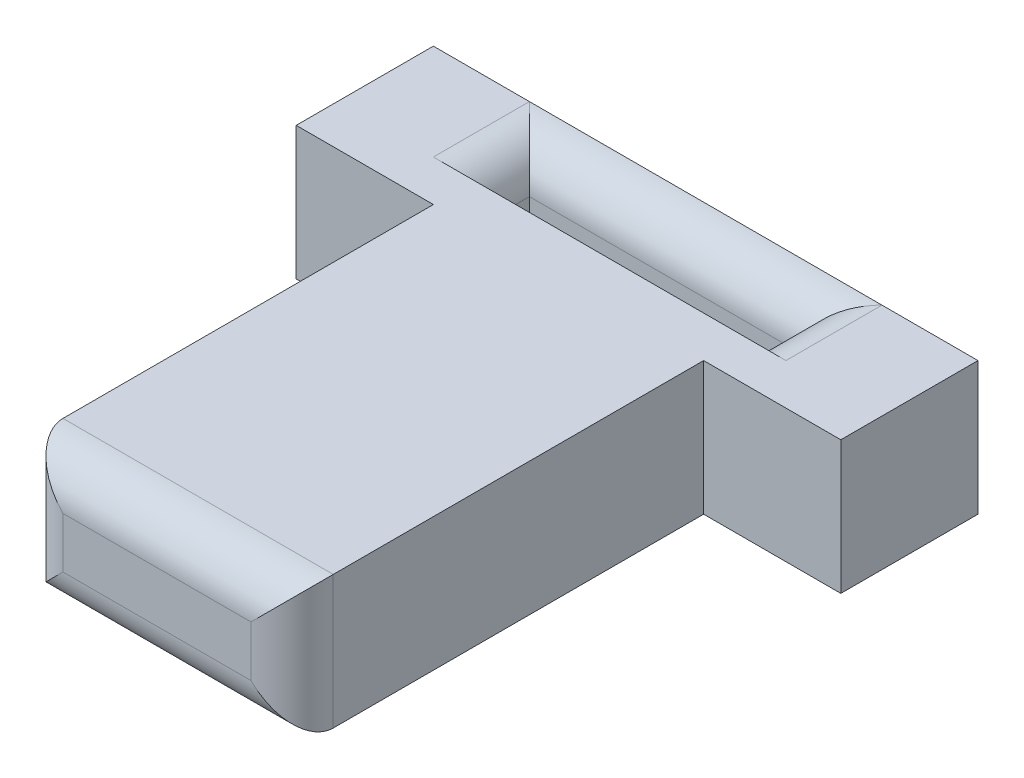
ISO-10303-21;
HEADER;
FILE_DESCRIPTION(('STEP AP214'),'2;1');
FILE_NAME('part.step','',(''),(''),'','','');
FILE_SCHEMA(('AUTOMOTIVE_DESIGN { 1 0 10303 214 1 1 1 1 }'));
ENDSEC;
DATA;
#1=APPLICATION_CONTEXT('core data for automotive mechanical design processes');
#2=APPLICATION_PROTOCOL_DEFINITION('international standard','automotive_design',2000,#1);
#3=PRODUCT_CONTEXT('',#1,'mechanical');
#4=PRODUCT('Part','Part','',(#3));
#5=PRODUCT_RELATED_PRODUCT_CATEGORY('part','',(#4));
#6=PRODUCT_DEFINITION_FORMATION('','',#4);
#7=PRODUCT_DEFINITION_CONTEXT('part definition',#1,'design');
#8=PRODUCT_DEFINITION('design','',#6,#7);
#9=PRODUCT_DEFINITION_SHAPE('','',#8);
#10=(LENGTH_UNIT() NAMED_UNIT(*) SI_UNIT(.MILLI.,.METRE.));
#11=(NAMED_UNIT(*) PLANE_ANGLE_UNIT() SI_UNIT($,.RADIAN.));
#12=(NAMED_UNIT(*) SI_UNIT($,.STERADIAN.) SOLID_ANGLE_UNIT());
#13=UNCERTAINTY_MEASURE_WITH_UNIT(LENGTH_MEASURE(1.E-05),#10,'distance_accuracy_value','');
#14=(GEOMETRIC_REPRESENTATION_CONTEXT(3) GLOBAL_UNCERTAINTY_ASSIGNED_CONTEXT((#13)) GLOBAL_UNIT_ASSIGNED_CONTEXT((#10,
#11,#12)) REPRESENTATION_CONTEXT('',''));
#15=CARTESIAN_POINT('',(0.,0.,0.));
#16=DIRECTION('',(0.,0.,1.));
#17=DIRECTION('',(1.,0.,0.));
#18=AXIS2_PLACEMENT_3D('',#15,#16,#17);
#19=CARTESIAN_POINT('',(-9.85,4.85,30.));
#20=DIRECTION('',(1.,0.,0.));
#21=DIRECTION('',(0.,1.,0.));
#22=AXIS2_PLACEMENT_3D('',#19,#20,#21);
#23=PLANE('',#22);
#24=DIRECTION('',(0.,0.,-1.));
#25=VECTOR('',#24,1.);
#26=CARTESIAN_POINT('',(-9.85,-4.85,30.));
#27=LINE('',#26,#25);
#28=CARTESIAN_POINT('',(-9.85,-4.85,27.));
#29=VERTEX_POINT('',#28);
#30=CARTESIAN_POINT('',(-9.85,-4.85,0.));
#31=VERTEX_POINT('',#30);
#32=EDGE_CURVE('E210',#29,#31,#27,.T.);
#33=ORIENTED_EDGE('',*,*,#32,.F.);
#34=DIRECTION('',(0.,-1.,0.));
#35=VECTOR('',#34,1.);
#36=CARTESIAN_POINT('',(-9.85,4.85,27.));
#37=LINE('',#36,#35);
#38=CARTESIAN_POINT('',(-9.85,4.85,27.));
#39=VERTEX_POINT('',#38);
#40=EDGE_CURVE('E11',#29,#39,#37,.F.);
#41=ORIENTED_EDGE('',*,*,#40,.T.);
#42=DIRECTION('',(0.,0.,-1.));
#43=VECTOR('',#42,1.);
#44=CARTESIAN_POINT('',(-9.85,4.85,30.));
#45=LINE('',#44,#43);
#46=CARTESIAN_POINT('',(-9.85,4.85,0.));
#47=VERTEX_POINT('',#46);
#48=EDGE_CURVE('E204',#39,#47,#45,.T.);
#49=ORIENTED_EDGE('',*,*,#48,.T.);
#50=DIRECTION('',(0.,-1.,0.));
#51=VECTOR('',#50,1.);
#52=CARTESIAN_POINT('',(-9.85,4.85,0.));
#53=LINE('',#52,#51);
#54=EDGE_CURVE('E191',#47,#31,#53,.T.);
#55=ORIENTED_EDGE('',*,*,#54,.T.);
#56=EDGE_LOOP('',(#33,#41,#49,#55));
#57=FACE_BOUND('',#56,.T.);
#58=ADVANCED_FACE('F37',(#57),#23,.F.);
#59=CARTESIAN_POINT('',(9.85,-4.85,30.));
#60=DIRECTION('',(0.,1.,0.));
#61=DIRECTION('',(-1.,0.,0.));
#62=AXIS2_PLACEMENT_3D('',#59,#60,#61);
#63=PLANE('',#62);
#64=DIRECTION('',(0.,0.,-1.));
#65=VECTOR('',#64,1.);
#66=CARTESIAN_POINT('',(9.85,-4.85,30.));
#67=LINE('',#66,#65);
#68=CARTESIAN_POINT('',(9.85,-4.85,27.));
#69=VERTEX_POINT('',#68);
#70=CARTESIAN_POINT('',(9.85,-4.85,0.));
#71=VERTEX_POINT('',#70);
#72=EDGE_CURVE('E208',#69,#71,#67,.T.);
#73=ORIENTED_EDGE('',*,*,#72,.F.);
#74=DIRECTION('',(1.,0.,0.));
#75=VECTOR('',#74,1.);
#76=CARTESIAN_POINT('',(9.85,-4.85,27.));
#77=LINE('',#76,#75);
#78=EDGE_CURVE('E46',#69,#29,#77,.F.);
#79=ORIENTED_EDGE('',*,*,#78,.T.);
#80=ORIENTED_EDGE('',*,*,#32,.T.);
#81=DIRECTION('',(-1.,0.,0.));
#82=VECTOR('',#81,1.);
#83=CARTESIAN_POINT('',(-19.85,-4.85,0.));
#84=LINE('',#83,#82);
#85=CARTESIAN_POINT('',(-19.85,-4.85,0.));
#86=VERTEX_POINT('',#85);
#87=EDGE_CURVE('E590',#31,#86,#84,.T.);
#88=ORIENTED_EDGE('',*,*,#87,.T.);
#89=DIRECTION('',(0.,0.,1.));
#90=VECTOR('',#89,1.);
#91=CARTESIAN_POINT('',(-19.85,-4.85,-10.));
#92=LINE('',#91,#90);
#93=CARTESIAN_POINT('',(-19.85,-4.85,-10.));
#94=VERTEX_POINT('',#93);
#95=EDGE_CURVE('E192',#94,#86,#92,.T.);
#96=ORIENTED_EDGE('',*,*,#95,.F.);
#97=DIRECTION('',(-1.,0.,0.));
#98=VECTOR('',#97,1.);
#99=CARTESIAN_POINT('',(-19.85,-4.85,-10.));
#100=LINE('',#99,#98);
#101=CARTESIAN_POINT('',(-12.85,-4.85,-10.));
#102=VERTEX_POINT('',#101);
#103=EDGE_CURVE('E177',#102,#94,#100,.T.);
#104=ORIENTED_EDGE('',*,*,#103,.F.);
#105=DIRECTION('',(0.,0.,1.));
#106=VECTOR('',#105,1.);
#107=CARTESIAN_POINT('',(-12.85,-4.85,30.));
#108=LINE('',#107,#106);
#109=CARTESIAN_POINT('',(-12.85,-4.85,-3.));
#110=VERTEX_POINT('',#109);
#111=EDGE_CURVE('E213',#102,#110,#108,.T.);
#112=ORIENTED_EDGE('',*,*,#111,.T.);
#113=DIRECTION('',(1.,0.,0.));
#114=VECTOR('',#113,1.);
#115=CARTESIAN_POINT('',(9.84999999999999,-4.85,-3.));
#116=LINE('',#115,#114);
#117=CARTESIAN_POINT('',(12.85,-4.85,-3.));
#118=VERTEX_POINT('',#117);
#119=EDGE_CURVE('E592',#110,#118,#116,.T.);
#120=ORIENTED_EDGE('',*,*,#119,.T.);
#121=DIRECTION('',(0.,0.,-1.));
#122=VECTOR('',#121,1.);
#123=CARTESIAN_POINT('',(12.85,-4.85,30.));
#124=LINE('',#123,#122);
#125=CARTESIAN_POINT('',(12.85,-4.85,-10.));
#126=VERTEX_POINT('',#125);
#127=EDGE_CURVE('E170',#118,#126,#124,.T.);
#128=ORIENTED_EDGE('',*,*,#127,.T.);
#129=CARTESIAN_POINT('',(19.85,-4.85,-10.));
#130=VERTEX_POINT('',#129);
#131=EDGE_CURVE('E162',#130,#126,#100,.T.);
#132=ORIENTED_EDGE('',*,*,#131,.F.);
#133=DIRECTION('',(0.,0.,1.));
#134=VECTOR('',#133,1.);
#135=CARTESIAN_POINT('',(19.85,-4.85,-10.));
#136=LINE('',#135,#134);
#137=CARTESIAN_POINT('',(19.85,-4.85,0.));
#138=VERTEX_POINT('',#137);
#139=EDGE_CURVE('E167',#130,#138,#136,.T.);
#140=ORIENTED_EDGE('',*,*,#139,.T.);
#141=EDGE_CURVE('E578',#138,#71,#84,.T.);
#142=ORIENTED_EDGE('',*,*,#141,.T.);
#143=EDGE_LOOP('',(#73,#79,#80,#88,#96,#104,#112,#120,#128,#132,#140,#142));
#144=FACE_BOUND('',#143,.T.);
#145=ADVANCED_FACE('F164',(#144),#63,.F.);
#146=CARTESIAN_POINT('',(9.85,4.85,30.));
#147=DIRECTION('',(-1.,0.,0.));
#148=DIRECTION('',(0.,-1.,0.));
#149=AXIS2_PLACEMENT_3D('',#146,#147,#148);
#150=PLANE('',#149);
#151=DIRECTION('',(0.,0.,-1.));
#152=VECTOR('',#151,1.);
#153=CARTESIAN_POINT('',(9.85,4.85,30.));
#154=LINE('',#153,#152);
#155=CARTESIAN_POINT('',(9.85,4.85,27.));
#156=VERTEX_POINT('',#155);
#157=CARTESIAN_POINT('',(9.85,4.85,0.));
#158=VERTEX_POINT('',#157);
#159=EDGE_CURVE('E206',#156,#158,#154,.T.);
#160=ORIENTED_EDGE('',*,*,#159,.F.);
#161=DIRECTION('',(0.,1.,0.));
#162=VECTOR('',#161,1.);
#163=CARTESIAN_POINT('',(9.85,4.85,27.));
#164=LINE('',#163,#162);
#165=EDGE_CURVE('E61',#156,#69,#164,.F.);
#166=ORIENTED_EDGE('',*,*,#165,.T.);
#167=ORIENTED_EDGE('',*,*,#72,.T.);
#168=DIRECTION('',(0.,1.,0.));
#169=VECTOR('',#168,1.);
#170=CARTESIAN_POINT('',(9.85,4.85,0.));
#171=LINE('',#170,#169);
#172=EDGE_CURVE('E195',#71,#158,#171,.T.);
#173=ORIENTED_EDGE('',*,*,#172,.T.);
#174=EDGE_LOOP('',(#160,#166,#167,#173));
#175=FACE_BOUND('',#174,.T.);
#176=ADVANCED_FACE('F313',(#175),#150,.F.);
#177=CARTESIAN_POINT('',(9.85,4.85,30.));
#178=DIRECTION('',(0.,-1.,0.));
#179=DIRECTION('',(1.,0.,0.));
#180=AXIS2_PLACEMENT_3D('',#177,#178,#179);
#181=PLANE('',#180);
#182=ORIENTED_EDGE('',*,*,#48,.F.);
#183=DIRECTION('',(-1.,0.,0.));
#184=VECTOR('',#183,1.);
#185=CARTESIAN_POINT('',(9.85,4.85,27.));
#186=LINE('',#185,#184);
#187=EDGE_CURVE('E265',#39,#156,#186,.F.);
#188=ORIENTED_EDGE('',*,*,#187,.T.);
#189=ORIENTED_EDGE('',*,*,#159,.T.);
#190=DIRECTION('',(1.,0.,0.));
#191=VECTOR('',#190,1.);
#192=CARTESIAN_POINT('',(-19.85,4.85,0.));
#193=LINE('',#192,#191);
#194=CARTESIAN_POINT('',(19.85,4.85,0.));
#195=VERTEX_POINT('',#194);
#196=EDGE_CURVE('E575',#158,#195,#193,.T.);
#197=ORIENTED_EDGE('',*,*,#196,.T.);
#198=DIRECTION('',(0.,0.,1.));
#199=VECTOR('',#198,1.);
#200=CARTESIAN_POINT('',(19.85,4.85,-10.));
#201=LINE('',#200,#199);
#202=CARTESIAN_POINT('',(19.85,4.85,-10.));
#203=VERTEX_POINT('',#202);
#204=EDGE_CURVE('E582',#203,#195,#201,.T.);
#205=ORIENTED_EDGE('',*,*,#204,.F.);
#206=DIRECTION('',(1.,0.,0.));
#207=VECTOR('',#206,1.);
#208=CARTESIAN_POINT('',(-19.85,4.85,-10.));
#209=LINE('',#208,#207);
#210=CARTESIAN_POINT('',(12.85,4.85,-10.));
#211=VERTEX_POINT('',#210);
#212=EDGE_CURVE('E182',#211,#203,#209,.T.);
#213=ORIENTED_EDGE('',*,*,#212,.F.);
#214=DIRECTION('',(0.,0.,-1.));
#215=VECTOR('',#214,1.);
#216=CARTESIAN_POINT('',(12.85,4.85,30.));
#217=LINE('',#216,#215);
#218=CARTESIAN_POINT('',(12.85,4.85,-3.));
#219=VERTEX_POINT('',#218);
#220=EDGE_CURVE('E227',#211,#219,#217,.F.);
#221=ORIENTED_EDGE('',*,*,#220,.T.);
#222=DIRECTION('',(1.,0.,0.));
#223=VECTOR('',#222,1.);
#224=CARTESIAN_POINT('',(9.85,4.85,-3.));
#225=LINE('',#224,#223);
#226=CARTESIAN_POINT('',(-12.85,4.85,-3.));
#227=VERTEX_POINT('',#226);
#228=EDGE_CURVE('E252',#227,#219,#225,.T.);
#229=ORIENTED_EDGE('',*,*,#228,.F.);
#230=DIRECTION('',(0.,0.,1.));
#231=VECTOR('',#230,1.);
#232=CARTESIAN_POINT('',(-12.85,4.85,30.));
#233=LINE('',#232,#231);
#234=CARTESIAN_POINT('',(-12.85,4.85,-10.));
#235=VERTEX_POINT('',#234);
#236=EDGE_CURVE('E225',#227,#235,#233,.F.);
#237=ORIENTED_EDGE('',*,*,#236,.T.);
#238=CARTESIAN_POINT('',(-19.85,4.85,-10.));
#239=VERTEX_POINT('',#238);
#240=EDGE_CURVE('E583',#239,#235,#209,.T.);
#241=ORIENTED_EDGE('',*,*,#240,.F.);
#242=DIRECTION('',(0.,0.,1.));
#243=VECTOR('',#242,1.);
#244=CARTESIAN_POINT('',(-19.85,4.85,-10.));
#245=LINE('',#244,#243);
#246=CARTESIAN_POINT('',(-19.85,4.85,0.));
#247=VERTEX_POINT('',#246);
#248=EDGE_CURVE('E198',#239,#247,#245,.T.);
#249=ORIENTED_EDGE('',*,*,#248,.T.);
#250=EDGE_CURVE('E186',#247,#47,#193,.T.);
#251=ORIENTED_EDGE('',*,*,#250,.T.);
#252=EDGE_LOOP('',(#182,#188,#189,#197,#205,#213,#221,#229,#237,#241,#249,#251));
#253=FACE_BOUND('',#252,.T.);
#254=ADVANCED_FACE('F295',(#253),#181,.F.);
#255=CARTESIAN_POINT('',(0.,0.,30.));
#256=DIRECTION('',(0.,0.,-1.));
#257=DIRECTION('',(-1.,0.,0.));
#258=AXIS2_PLACEMENT_3D('',#255,#256,#257);
#259=PLANE('',#258);
#260=DIRECTION('',(0.,1.,0.));
#261=VECTOR('',#260,1.);
#262=CARTESIAN_POINT('',(6.85,0.,30.));
#263=LINE('',#262,#261);
#264=CARTESIAN_POINT('',(6.85,-1.85,30.));
#265=VERTEX_POINT('',#264);
#266=CARTESIAN_POINT('',(6.85,1.85,30.));
#267=VERTEX_POINT('',#266);
#268=EDGE_CURVE('E260',#265,#267,#263,.T.);
#269=ORIENTED_EDGE('',*,*,#268,.T.);
#270=DIRECTION('',(-1.,0.,0.));
#271=VECTOR('',#270,1.);
#272=CARTESIAN_POINT('',(0.,1.85,30.));
#273=LINE('',#272,#271);
#274=CARTESIAN_POINT('',(-6.85,1.85,30.));
#275=VERTEX_POINT('',#274);
#276=EDGE_CURVE('E262',#267,#275,#273,.T.);
#277=ORIENTED_EDGE('',*,*,#276,.T.);
#278=DIRECTION('',(0.,-1.,0.));
#279=VECTOR('',#278,1.);
#280=CARTESIAN_POINT('',(-6.85,0.,30.));
#281=LINE('',#280,#279);
#282=CARTESIAN_POINT('',(-6.85,-1.85,30.));
#283=VERTEX_POINT('',#282);
#284=EDGE_CURVE('E244',#275,#283,#281,.T.);
#285=ORIENTED_EDGE('',*,*,#284,.T.);
#286=DIRECTION('',(1.,0.,0.));
#287=VECTOR('',#286,1.);
#288=CARTESIAN_POINT('',(0.,-1.85,30.));
#289=LINE('',#288,#287);
#290=EDGE_CURVE('E258',#283,#265,#289,.T.);
#291=ORIENTED_EDGE('',*,*,#290,.T.);
#292=EDGE_LOOP('',(#269,#277,#285,#291));
#293=FACE_BOUND('',#292,.T.);
#294=ADVANCED_FACE('F302',(#293),#259,.F.);
#295=CARTESIAN_POINT('',(0.,0.,0.));
#296=DIRECTION('',(0.,0.,1.));
#297=DIRECTION('',(1.,0.,0.));
#298=AXIS2_PLACEMENT_3D('',#295,#296,#297);
#299=PLANE('',#298);
#300=ORIENTED_EDGE('',*,*,#54,.F.);
#301=ORIENTED_EDGE('',*,*,#250,.F.);
#302=DIRECTION('',(0.,1.,0.));
#303=VECTOR('',#302,1.);
#304=CARTESIAN_POINT('',(-19.85,4.85,0.));
#305=LINE('',#304,#303);
#306=EDGE_CURVE('E576',#86,#247,#305,.T.);
#307=ORIENTED_EDGE('',*,*,#306,.F.);
#308=ORIENTED_EDGE('',*,*,#87,.F.);
#309=EDGE_LOOP('',(#300,#301,#307,#308));
#310=FACE_BOUND('',#309,.T.);
#311=ADVANCED_FACE('F304',(#310),#299,.T.);
#312=ORIENTED_EDGE('',*,*,#172,.F.);
#313=ORIENTED_EDGE('',*,*,#141,.F.);
#314=DIRECTION('',(0.,-1.,0.));
#315=VECTOR('',#314,1.);
#316=CARTESIAN_POINT('',(19.85,4.85,0.));
#317=LINE('',#316,#315);
#318=EDGE_CURVE('E190',#195,#138,#317,.T.);
#319=ORIENTED_EDGE('',*,*,#318,.F.);
#320=ORIENTED_EDGE('',*,*,#196,.F.);
#321=EDGE_LOOP('',(#312,#313,#319,#320));
#322=FACE_BOUND('',#321,.T.);
#323=ADVANCED_FACE('F310',(#322),#299,.T.);
#324=CARTESIAN_POINT('',(19.85,4.85,-10.));
#325=DIRECTION('',(-1.,0.,0.));
#326=DIRECTION('',(0.,0.,1.));
#327=AXIS2_PLACEMENT_3D('',#324,#325,#326);
#328=PLANE('',#327);
#329=ORIENTED_EDGE('',*,*,#318,.T.);
#330=ORIENTED_EDGE('',*,*,#139,.F.);
#331=DIRECTION('',(0.,-1.,0.));
#332=VECTOR('',#331,1.);
#333=CARTESIAN_POINT('',(19.85,4.85,-10.));
#334=LINE('',#333,#332);
#335=EDGE_CURVE('E179',#203,#130,#334,.T.);
#336=ORIENTED_EDGE('',*,*,#335,.F.);
#337=ORIENTED_EDGE('',*,*,#204,.T.);
#338=EDGE_LOOP('',(#329,#330,#336,#337));
#339=FACE_BOUND('',#338,.T.);
#340=ADVANCED_FACE('F188',(#339),#328,.F.);
#341=CARTESIAN_POINT('',(-19.85,4.85,-10.));
#342=DIRECTION('',(1.,0.,0.));
#343=DIRECTION('',(0.,0.,-1.));
#344=AXIS2_PLACEMENT_3D('',#341,#342,#343);
#345=PLANE('',#344);
#346=ORIENTED_EDGE('',*,*,#306,.T.);
#347=ORIENTED_EDGE('',*,*,#248,.F.);
#348=DIRECTION('',(0.,1.,0.));
#349=VECTOR('',#348,1.);
#350=CARTESIAN_POINT('',(-19.85,4.85,-10.));
#351=LINE('',#350,#349);
#352=EDGE_CURVE('E174',#94,#239,#351,.T.);
#353=ORIENTED_EDGE('',*,*,#352,.F.);
#354=ORIENTED_EDGE('',*,*,#95,.T.);
#355=EDGE_LOOP('',(#346,#347,#353,#354));
#356=FACE_BOUND('',#355,.T.);
#357=ADVANCED_FACE('F419',(#356),#345,.F.);
#358=CARTESIAN_POINT('',(0.,0.,-10.));
#359=DIRECTION('',(0.,0.,1.));
#360=DIRECTION('',(1.,0.,0.));
#361=AXIS2_PLACEMENT_3D('',#358,#359,#360);
#362=PLANE('',#361);
#363=ORIENTED_EDGE('',*,*,#335,.T.);
#364=ORIENTED_EDGE('',*,*,#131,.T.);
#365=EDGE_CURVE('E175',#126,#102,#100,.T.);
#366=ORIENTED_EDGE('',*,*,#365,.T.);
#367=ORIENTED_EDGE('',*,*,#103,.T.);
#368=ORIENTED_EDGE('',*,*,#352,.T.);
#369=ORIENTED_EDGE('',*,*,#240,.T.);
#370=EDGE_CURVE('E596',#235,#211,#209,.T.);
#371=ORIENTED_EDGE('',*,*,#370,.T.);
#372=ORIENTED_EDGE('',*,*,#212,.T.);
#373=EDGE_LOOP('',(#363,#364,#366,#367,#368,#369,#371,#372));
#374=FACE_BOUND('',#373,.T.);
#375=ADVANCED_FACE('F180',(#374),#362,.F.);
#376=CARTESIAN_POINT('',(-9.85,-5.15,-7.));
#377=DIRECTION('',(-1.,0.,0.));
#378=DIRECTION('',(0.,-1.,0.));
#379=AXIS2_PLACEMENT_3D('',#376,#377,#378);
#380=PLANE('',#379);
#381=DIRECTION('',(0.,1.,0.));
#382=VECTOR('',#381,1.);
#383=CARTESIAN_POINT('',(-9.85,-5.15,-3.));
#384=LINE('',#383,#382);
#385=CARTESIAN_POINT('',(-9.85,-1.85,-3.));
#386=VERTEX_POINT('',#385);
#387=CARTESIAN_POINT('',(-9.85,1.85,-3.));
#388=VERTEX_POINT('',#387);
#389=EDGE_CURVE('E600',#386,#388,#384,.T.);
#390=ORIENTED_EDGE('',*,*,#389,.F.);
#391=DIRECTION('',(0.,0.,1.));
#392=VECTOR('',#391,1.);
#393=CARTESIAN_POINT('',(-9.85,-1.85,-7.));
#394=LINE('',#393,#392);
#395=CARTESIAN_POINT('',(-9.85,-1.85,-7.));
#396=VERTEX_POINT('',#395);
#397=EDGE_CURVE('E218',#386,#396,#394,.F.);
#398=ORIENTED_EDGE('',*,*,#397,.T.);
#399=DIRECTION('',(0.,1.,0.));
#400=VECTOR('',#399,1.);
#401=CARTESIAN_POINT('',(-9.85,-5.15,-7.));
#402=LINE('',#401,#400);
#403=CARTESIAN_POINT('',(-9.85,1.85,-7.));
#404=VERTEX_POINT('',#403);
#405=EDGE_CURVE('E599',#396,#404,#402,.T.);
#406=ORIENTED_EDGE('',*,*,#405,.T.);
#407=DIRECTION('',(0.,0.,1.));
#408=VECTOR('',#407,1.);
#409=CARTESIAN_POINT('',(-9.85,1.85,-7.));
#410=LINE('',#409,#408);
#411=EDGE_CURVE('E216',#404,#388,#410,.T.);
#412=ORIENTED_EDGE('',*,*,#411,.T.);
#413=EDGE_LOOP('',(#390,#398,#406,#412));
#414=FACE_BOUND('',#413,.T.);
#415=ADVANCED_FACE('F404',(#414),#380,.F.);
#416=CARTESIAN_POINT('',(9.85,-5.15,-7.));
#417=DIRECTION('',(0.,0.,-1.));
#418=DIRECTION('',(-1.,0.,0.));
#419=AXIS2_PLACEMENT_3D('',#416,#417,#418);
#420=PLANE('',#419);
#421=ORIENTED_EDGE('',*,*,#405,.F.);
#422=DIRECTION('',(-1.,0.,0.));
#423=VECTOR('',#422,1.);
#424=CARTESIAN_POINT('',(9.85,-1.85,-7.));
#425=LINE('',#424,#423);
#426=CARTESIAN_POINT('',(9.85,-1.85,-7.));
#427=VERTEX_POINT('',#426);
#428=EDGE_CURVE('E232',#396,#427,#425,.F.);
#429=ORIENTED_EDGE('',*,*,#428,.T.);
#430=DIRECTION('',(0.,1.,0.));
#431=VECTOR('',#430,1.);
#432=CARTESIAN_POINT('',(9.85,-5.15,-7.));
#433=LINE('',#432,#431);
#434=CARTESIAN_POINT('',(9.85,1.85,-7.));
#435=VERTEX_POINT('',#434);
#436=EDGE_CURVE('E606',#427,#435,#433,.T.);
#437=ORIENTED_EDGE('',*,*,#436,.T.);
#438=DIRECTION('',(-1.,0.,0.));
#439=VECTOR('',#438,1.);
#440=CARTESIAN_POINT('',(9.85,1.85,-7.));
#441=LINE('',#440,#439);
#442=EDGE_CURVE('E230',#435,#404,#441,.T.);
#443=ORIENTED_EDGE('',*,*,#442,.T.);
#444=EDGE_LOOP('',(#421,#429,#437,#443));
#445=FACE_BOUND('',#444,.T.);
#446=ADVANCED_FACE('F396',(#445),#420,.F.);
#447=CARTESIAN_POINT('',(9.85,-5.15,-7.));
#448=DIRECTION('',(1.,0.,0.));
#449=DIRECTION('',(0.,1.,0.));
#450=AXIS2_PLACEMENT_3D('',#447,#448,#449);
#451=PLANE('',#450);
#452=ORIENTED_EDGE('',*,*,#436,.F.);
#453=DIRECTION('',(0.,0.,-1.));
#454=VECTOR('',#453,1.);
#455=CARTESIAN_POINT('',(9.85,-1.85,-7.));
#456=LINE('',#455,#454);
#457=CARTESIAN_POINT('',(9.85,-1.85,-3.));
#458=VERTEX_POINT('',#457);
#459=EDGE_CURVE('E223',#427,#458,#456,.F.);
#460=ORIENTED_EDGE('',*,*,#459,.T.);
#461=DIRECTION('',(0.,1.,0.));
#462=VECTOR('',#461,1.);
#463=CARTESIAN_POINT('',(9.85,-5.15,-3.));
#464=LINE('',#463,#462);
#465=CARTESIAN_POINT('',(9.85,1.85,-3.));
#466=VERTEX_POINT('',#465);
#467=EDGE_CURVE('E603',#458,#466,#464,.T.);
#468=ORIENTED_EDGE('',*,*,#467,.T.);
#469=DIRECTION('',(0.,0.,-1.));
#470=VECTOR('',#469,1.);
#471=CARTESIAN_POINT('',(9.85,1.85,-7.));
#472=LINE('',#471,#470);
#473=EDGE_CURVE('E220',#466,#435,#472,.T.);
#474=ORIENTED_EDGE('',*,*,#473,.T.);
#475=EDGE_LOOP('',(#452,#460,#468,#474));
#476=FACE_BOUND('',#475,.T.);
#477=ADVANCED_FACE('F388',(#476),#451,.F.);
#478=CARTESIAN_POINT('',(9.85,-5.15,-3.));
#479=DIRECTION('',(0.,0.,1.));
#480=DIRECTION('',(1.,0.,0.));
#481=AXIS2_PLACEMENT_3D('',#478,#479,#480);
#482=PLANE('',#481);
#483=ORIENTED_EDGE('',*,*,#119,.F.);
#484=CARTESIAN_POINT('',(-12.85,-1.85,-3.));
#485=DIRECTION('',(0.,0.,1.));
#486=DIRECTION('',(1.,0.,0.));
#487=AXIS2_PLACEMENT_3D('',#484,#485,#486);
#488=CIRCLE('',#487,3.);
#489=EDGE_CURVE('E234',#110,#386,#488,.T.);
#490=ORIENTED_EDGE('',*,*,#489,.T.);
#491=ORIENTED_EDGE('',*,*,#389,.T.);
#492=CARTESIAN_POINT('',(-12.85,1.85,-3.));
#493=DIRECTION('',(0.,0.,1.));
#494=DIRECTION('',(1.,0.,0.));
#495=AXIS2_PLACEMENT_3D('',#492,#493,#494);
#496=CIRCLE('',#495,3.);
#497=EDGE_CURVE('E241',#388,#227,#496,.T.);
#498=ORIENTED_EDGE('',*,*,#497,.T.);
#499=ORIENTED_EDGE('',*,*,#228,.T.);
#500=CARTESIAN_POINT('',(12.85,1.85,-3.));
#501=DIRECTION('',(0.,0.,1.));
#502=DIRECTION('',(1.,0.,0.));
#503=AXIS2_PLACEMENT_3D('',#500,#501,#502);
#504=CIRCLE('',#503,3.);
#505=EDGE_CURVE('E239',#219,#466,#504,.T.);
#506=ORIENTED_EDGE('',*,*,#505,.T.);
#507=ORIENTED_EDGE('',*,*,#467,.F.);
#508=CARTESIAN_POINT('',(12.85,-1.85,-3.));
#509=DIRECTION('',(0.,0.,1.));
#510=DIRECTION('',(1.,0.,0.));
#511=AXIS2_PLACEMENT_3D('',#508,#509,#510);
#512=CIRCLE('',#511,3.);
#513=EDGE_CURVE('E236',#458,#118,#512,.T.);
#514=ORIENTED_EDGE('',*,*,#513,.T.);
#515=EDGE_LOOP('',(#483,#490,#491,#498,#499,#506,#507,#514));
#516=FACE_BOUND('',#515,.T.);
#517=ADVANCED_FACE('F336',(#516),#482,.F.);
#518=CARTESIAN_POINT('',(12.85,-1.85,30.));
#519=DIRECTION('',(0.,0.,-1.));
#520=DIRECTION('',(-1.,0.,0.));
#521=AXIS2_PLACEMENT_3D('',#518,#519,#520);
#522=CYLINDRICAL_SURFACE('',#521,3.);
#523=ORIENTED_EDGE('',*,*,#513,.F.);
#524=ORIENTED_EDGE('',*,*,#459,.F.);
#525=CARTESIAN_POINT('',(12.85,-1.85,-10.));
#526=DIRECTION('',(-0.707106781186548,0.,-0.707106781186547));
#527=DIRECTION('',(0.707106781186547,0.,-0.707106781186548));
#528=AXIS2_PLACEMENT_3D('',#525,#526,#527);
#529=ELLIPSE('',#528,4.24264068711929,3.);
#530=EDGE_CURVE('E248',#126,#427,#529,.T.);
#531=ORIENTED_EDGE('',*,*,#530,.F.);
#532=ORIENTED_EDGE('',*,*,#127,.F.);
#533=EDGE_LOOP('',(#523,#524,#531,#532));
#534=FACE_BOUND('',#533,.T.);
#535=ADVANCED_FACE('F332',(#534),#522,.T.);
#536=CARTESIAN_POINT('',(9.84999999999999,-1.85,-10.));
#537=DIRECTION('',(-1.,0.,0.));
#538=DIRECTION('',(0.,-1.,0.));
#539=AXIS2_PLACEMENT_3D('',#536,#537,#538);
#540=CYLINDRICAL_SURFACE('',#539,3.);
#541=ORIENTED_EDGE('',*,*,#530,.T.);
#542=ORIENTED_EDGE('',*,*,#428,.F.);
#543=CARTESIAN_POINT('',(-12.85,-1.85,-10.));
#544=DIRECTION('',(-0.707106781186547,0.,0.707106781186548));
#545=DIRECTION('',(0.707106781186548,0.,0.707106781186547));
#546=AXIS2_PLACEMENT_3D('',#543,#544,#545);
#547=ELLIPSE('',#546,4.24264068711928,3.);
#548=EDGE_CURVE('E245',#102,#396,#547,.T.);
#549=ORIENTED_EDGE('',*,*,#548,.F.);
#550=ORIENTED_EDGE('',*,*,#365,.F.);
#551=EDGE_LOOP('',(#541,#542,#549,#550));
#552=FACE_BOUND('',#551,.T.);
#553=ADVANCED_FACE('F328',(#552),#540,.T.);
#554=CARTESIAN_POINT('',(-12.85,-1.85,30.));
#555=DIRECTION('',(0.,0.,1.));
#556=DIRECTION('',(1.,0.,0.));
#557=AXIS2_PLACEMENT_3D('',#554,#555,#556);
#558=CYLINDRICAL_SURFACE('',#557,3.);
#559=ORIENTED_EDGE('',*,*,#548,.T.);
#560=ORIENTED_EDGE('',*,*,#397,.F.);
#561=ORIENTED_EDGE('',*,*,#489,.F.);
#562=ORIENTED_EDGE('',*,*,#111,.F.);
#563=EDGE_LOOP('',(#559,#560,#561,#562));
#564=FACE_BOUND('',#563,.T.);
#565=ADVANCED_FACE('F324',(#564),#558,.T.);
#566=CARTESIAN_POINT('',(-12.85,1.85,-7.));
#567=DIRECTION('',(0.,0.,1.));
#568=DIRECTION('',(1.,0.,0.));
#569=AXIS2_PLACEMENT_3D('',#566,#567,#568);
#570=CYLINDRICAL_SURFACE('',#569,3.);
#571=ORIENTED_EDGE('',*,*,#497,.F.);
#572=ORIENTED_EDGE('',*,*,#411,.F.);
#573=CARTESIAN_POINT('',(-12.85,1.85,-10.));
#574=DIRECTION('',(-0.707106781186547,0.,0.707106781186548));
#575=DIRECTION('',(0.707106781186548,0.,0.707106781186547));
#576=AXIS2_PLACEMENT_3D('',#573,#574,#575);
#577=ELLIPSE('',#576,4.24264068711928,3.);
#578=EDGE_CURVE('E249',#235,#404,#577,.F.);
#579=ORIENTED_EDGE('',*,*,#578,.F.);
#580=ORIENTED_EDGE('',*,*,#236,.F.);
#581=EDGE_LOOP('',(#571,#572,#579,#580));
#582=FACE_BOUND('',#581,.T.);
#583=ADVANCED_FACE('F327',(#582),#570,.T.);
#584=CARTESIAN_POINT('',(9.85,1.85,-10.));
#585=DIRECTION('',(-1.,0.,0.));
#586=DIRECTION('',(0.,-1.,0.));
#587=AXIS2_PLACEMENT_3D('',#584,#585,#586);
#588=CYLINDRICAL_SURFACE('',#587,3.);
#589=ORIENTED_EDGE('',*,*,#578,.T.);
#590=ORIENTED_EDGE('',*,*,#442,.F.);
#591=CARTESIAN_POINT('',(12.85,1.85,-10.));
#592=DIRECTION('',(-0.707106781186548,0.,-0.707106781186547));
#593=DIRECTION('',(0.707106781186547,0.,-0.707106781186548));
#594=AXIS2_PLACEMENT_3D('',#591,#592,#593);
#595=ELLIPSE('',#594,4.24264068711929,3.);
#596=EDGE_CURVE('E253',#211,#435,#595,.F.);
#597=ORIENTED_EDGE('',*,*,#596,.F.);
#598=ORIENTED_EDGE('',*,*,#370,.F.);
#599=EDGE_LOOP('',(#589,#590,#597,#598));
#600=FACE_BOUND('',#599,.T.);
#601=ADVANCED_FACE('F341',(#600),#588,.T.);
#602=CARTESIAN_POINT('',(12.85,1.85,-7.));
#603=DIRECTION('',(0.,0.,-1.));
#604=DIRECTION('',(-1.,0.,0.));
#605=AXIS2_PLACEMENT_3D('',#602,#603,#604);
#606=CYLINDRICAL_SURFACE('',#605,3.);
#607=ORIENTED_EDGE('',*,*,#505,.F.);
#608=ORIENTED_EDGE('',*,*,#220,.F.);
#609=ORIENTED_EDGE('',*,*,#596,.T.);
#610=ORIENTED_EDGE('',*,*,#473,.F.);
#611=EDGE_LOOP('',(#607,#608,#609,#610));
#612=FACE_BOUND('',#611,.T.);
#613=ADVANCED_FACE('F338',(#612),#606,.T.);
#614=CARTESIAN_POINT('',(0.,-1.85,27.));
#615=DIRECTION('',(1.,0.,0.));
#616=DIRECTION('',(0.,1.,0.));
#617=AXIS2_PLACEMENT_3D('',#614,#615,#616);
#618=CYLINDRICAL_SURFACE('',#617,3.);
#619=CARTESIAN_POINT('',(-6.85,-1.85,27.));
#620=DIRECTION('',(0.707106781186548,-0.707106781186547,0.));
#621=DIRECTION('',(-0.707106781186547,-0.707106781186548,0.));
#622=AXIS2_PLACEMENT_3D('',#619,#620,#621);
#623=ELLIPSE('',#622,4.24264068711928,3.);
#624=EDGE_CURVE('E273',#29,#283,#623,.F.);
#625=ORIENTED_EDGE('',*,*,#624,.F.);
#626=ORIENTED_EDGE('',*,*,#78,.F.);
#627=CARTESIAN_POINT('',(6.85,-1.85,27.));
#628=DIRECTION('',(0.707106781186547,0.707106781186548,0.));
#629=DIRECTION('',(0.707106781186548,-0.707106781186547,0.));
#630=AXIS2_PLACEMENT_3D('',#627,#628,#629);
#631=ELLIPSE('',#630,4.24264068711928,3.);
#632=EDGE_CURVE('E41',#265,#69,#631,.T.);
#633=ORIENTED_EDGE('',*,*,#632,.F.);
#634=ORIENTED_EDGE('',*,*,#290,.F.);
#635=EDGE_LOOP('',(#625,#626,#633,#634));
#636=FACE_BOUND('',#635,.T.);
#637=ADVANCED_FACE('F39',(#636),#618,.T.);
#638=CARTESIAN_POINT('',(6.85,0.,27.));
#639=DIRECTION('',(0.,1.,0.));
#640=DIRECTION('',(-1.,0.,0.));
#641=AXIS2_PLACEMENT_3D('',#638,#639,#640);
#642=CYLINDRICAL_SURFACE('',#641,3.);
#643=ORIENTED_EDGE('',*,*,#632,.T.);
#644=ORIENTED_EDGE('',*,*,#165,.F.);
#645=CARTESIAN_POINT('',(6.85,1.85,27.));
#646=DIRECTION('',(-0.707106781186548,0.707106781186547,0.));
#647=DIRECTION('',(0.707106781186547,0.707106781186548,0.));
#648=AXIS2_PLACEMENT_3D('',#645,#646,#647);
#649=ELLIPSE('',#648,4.24264068711928,3.);
#650=EDGE_CURVE('E272',#267,#156,#649,.T.);
#651=ORIENTED_EDGE('',*,*,#650,.F.);
#652=ORIENTED_EDGE('',*,*,#268,.F.);
#653=EDGE_LOOP('',(#643,#644,#651,#652));
#654=FACE_BOUND('',#653,.T.);
#655=ADVANCED_FACE('F283',(#654),#642,.T.);
#656=CARTESIAN_POINT('',(-6.85,0.,27.));
#657=DIRECTION('',(0.,-1.,0.));
#658=DIRECTION('',(1.,0.,0.));
#659=AXIS2_PLACEMENT_3D('',#656,#657,#658);
#660=CYLINDRICAL_SURFACE('',#659,3.);
#661=ORIENTED_EDGE('',*,*,#624,.T.);
#662=ORIENTED_EDGE('',*,*,#284,.F.);
#663=CARTESIAN_POINT('',(-6.85,1.85,27.));
#664=DIRECTION('',(-0.707106781186547,-0.707106781186548,0.));
#665=DIRECTION('',(0.707106781186548,-0.707106781186547,0.));
#666=AXIS2_PLACEMENT_3D('',#663,#664,#665);
#667=ELLIPSE('',#666,4.24264068711928,3.);
#668=EDGE_CURVE('E270',#39,#275,#667,.F.);
#669=ORIENTED_EDGE('',*,*,#668,.F.);
#670=ORIENTED_EDGE('',*,*,#40,.F.);
#671=EDGE_LOOP('',(#661,#662,#669,#670));
#672=FACE_BOUND('',#671,.T.);
#673=ADVANCED_FACE('F288',(#672),#660,.T.);
#674=CARTESIAN_POINT('',(0.,1.85,27.));
#675=DIRECTION('',(-1.,0.,0.));
#676=DIRECTION('',(0.,-1.,0.));
#677=AXIS2_PLACEMENT_3D('',#674,#675,#676);
#678=CYLINDRICAL_SURFACE('',#677,3.);
#679=ORIENTED_EDGE('',*,*,#650,.T.);
#680=ORIENTED_EDGE('',*,*,#187,.F.);
#681=ORIENTED_EDGE('',*,*,#668,.T.);
#682=ORIENTED_EDGE('',*,*,#276,.F.);
#683=EDGE_LOOP('',(#679,#680,#681,#682));
#684=FACE_BOUND('',#683,.T.);
#685=ADVANCED_FACE('F299',(#684),#678,.T.);
#686=CLOSED_SHELL('',(#58,#145,#176,#254,#294,#311,#323,#340,#357,#375,#415,#446,#477,#517,#535,
#553,#565,#583,#601,#613,#637,#655,#673,#685));
#687=MANIFOLD_SOLID_BREP('B2',#686);
#688=ADVANCED_BREP_SHAPE_REPRESENTATION('',(#18,#687),#14);
#689=SHAPE_DEFINITION_REPRESENTATION(#9,#688);
ENDSEC;
END-ISO-10303-21;
